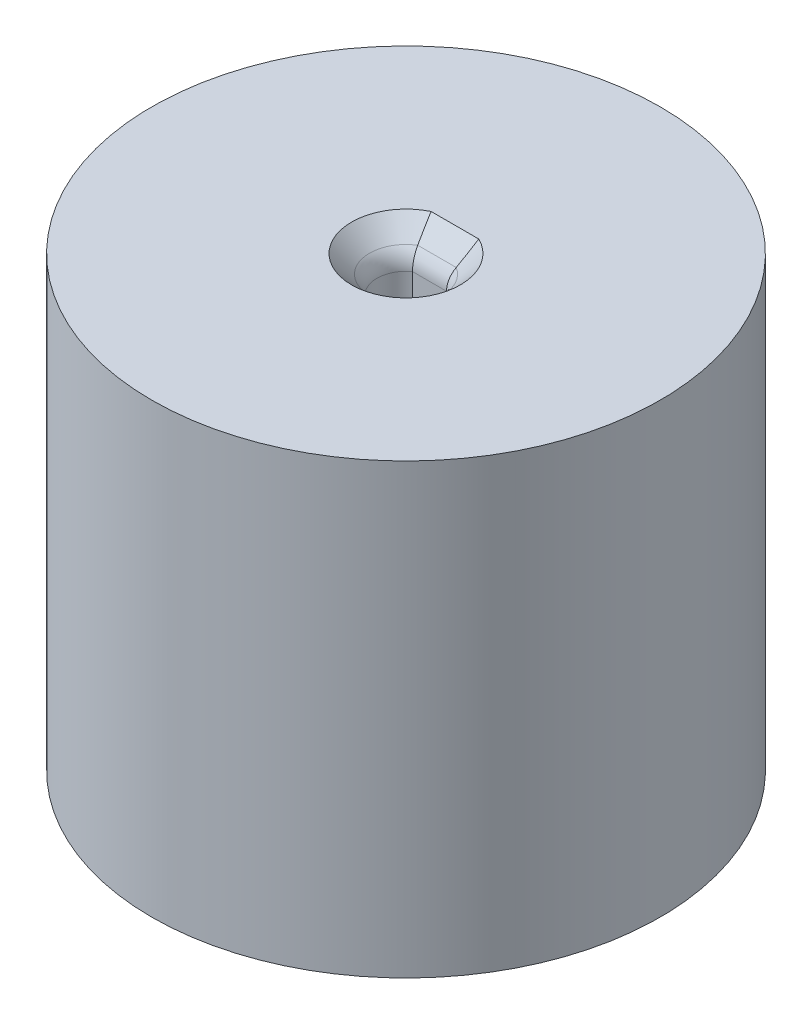
ISO-10303-21;
HEADER;
FILE_DESCRIPTION(('STEP AP214'),'2;1');
FILE_NAME('part.step','',(''),(''),'','','');
FILE_SCHEMA(('AUTOMOTIVE_DESIGN { 1 0 10303 214 1 1 1 1 }'));
ENDSEC;
DATA;
#1=APPLICATION_CONTEXT('core data for automotive mechanical design processes');
#2=APPLICATION_PROTOCOL_DEFINITION('international standard','automotive_design',2000,#1);
#3=PRODUCT_CONTEXT('',#1,'mechanical');
#4=PRODUCT('Part','Part','',(#3));
#5=PRODUCT_RELATED_PRODUCT_CATEGORY('part','',(#4));
#6=PRODUCT_DEFINITION_FORMATION('','',#4);
#7=PRODUCT_DEFINITION_CONTEXT('part definition',#1,'design');
#8=PRODUCT_DEFINITION('design','',#6,#7);
#9=PRODUCT_DEFINITION_SHAPE('','',#8);
#10=(LENGTH_UNIT() NAMED_UNIT(*) SI_UNIT(.MILLI.,.METRE.));
#11=(NAMED_UNIT(*) PLANE_ANGLE_UNIT() SI_UNIT($,.RADIAN.));
#12=(NAMED_UNIT(*) SI_UNIT($,.STERADIAN.) SOLID_ANGLE_UNIT());
#13=UNCERTAINTY_MEASURE_WITH_UNIT(LENGTH_MEASURE(1.E-05),#10,'distance_accuracy_value','');
#14=(GEOMETRIC_REPRESENTATION_CONTEXT(3) GLOBAL_UNCERTAINTY_ASSIGNED_CONTEXT((#13)) GLOBAL_UNIT_ASSIGNED_CONTEXT((#10,
#11,#12)) REPRESENTATION_CONTEXT('',''));
#15=CARTESIAN_POINT('',(0.,0.,0.));
#16=DIRECTION('',(0.,0.,1.));
#17=DIRECTION('',(1.,0.,0.));
#18=AXIS2_PLACEMENT_3D('',#15,#16,#17);
#19=CARTESIAN_POINT('',(0.,22.87,0.));
#20=DIRECTION('',(0.,-1.,0.));
#21=DIRECTION('',(0.,0.,-1.));
#22=AXIS2_PLACEMENT_3D('',#19,#20,#21);
#23=CONICAL_SURFACE('',#22,18.250000092,0.0327823058524812);
#24=CARTESIAN_POINT('',(0.,2.45674785656746,0.));
#25=DIRECTION('',(0.,1.,0.));
#26=DIRECTION('',(0.,0.,1.));
#27=AXIS2_PLACEMENT_3D('',#24,#25,#26);
#28=CIRCLE('',#27,18.9194333931584);
#29=CARTESIAN_POINT('',(0.,2.45674785656746,18.9194333931584));
#30=VERTEX_POINT('',#29);
#31=EDGE_CURVE('E45',#30,#30,#28,.F.);
#32=ORIENTED_EDGE('',*,*,#31,.T.);
#33=EDGE_LOOP('',(#32));
#34=FACE_BOUND('',#33,.T.);
#35=CARTESIAN_POINT('',(0.,22.87,0.));
#36=DIRECTION('',(0.,-1.,0.));
#37=DIRECTION('',(0.,0.,-1.));
#38=AXIS2_PLACEMENT_3D('',#35,#36,#37);
#39=CIRCLE('',#38,18.250000092);
#40=CARTESIAN_POINT('',(0.,22.87,-18.250000092));
#41=VERTEX_POINT('',#40);
#42=EDGE_CURVE('E98',#41,#41,#39,.T.);
#43=ORIENTED_EDGE('',*,*,#42,.F.);
#44=EDGE_LOOP('',(#43));
#45=FACE_BOUND('',#44,.T.);
#46=ADVANCED_FACE('F37',(#34,#45),#23,.F.);
#47=CARTESIAN_POINT('',(0.,22.87,0.));
#48=DIRECTION('',(0.,-1.,0.));
#49=DIRECTION('',(0.,0.,-1.));
#50=AXIS2_PLACEMENT_3D('',#47,#48,#49);
#51=PLANE('',#50);
#52=CARTESIAN_POINT('',(0.,22.87,0.));
#53=DIRECTION('',(0.,-1.,0.));
#54=DIRECTION('',(0.,0.,-1.));
#55=AXIS2_PLACEMENT_3D('',#52,#53,#54);
#56=CIRCLE('',#55,2.900000034);
#57=CARTESIAN_POINT('',(1.69926449418564,22.87,-2.35000008));
#58=VERTEX_POINT('',#57);
#59=CARTESIAN_POINT('',(-1.69926449418564,22.87,-2.35000008));
#60=VERTEX_POINT('',#59);
#61=EDGE_CURVE('E86',#58,#60,#56,.T.);
#62=ORIENTED_EDGE('',*,*,#61,.F.);
#63=DIRECTION('',(1.,0.,0.));
#64=VECTOR('',#63,1.);
#65=CARTESIAN_POINT('',(0.,22.87,-2.35000008));
#66=LINE('',#65,#64);
#67=EDGE_CURVE('E95',#60,#58,#66,.T.);
#68=ORIENTED_EDGE('',*,*,#67,.F.);
#69=EDGE_LOOP('',(#62,#68));
#70=FACE_BOUND('',#69,.T.);
#71=ORIENTED_EDGE('',*,*,#42,.T.);
#72=EDGE_LOOP('',(#71));
#73=FACE_BOUND('',#72,.T.);
#74=ADVANCED_FACE('F100',(#70,#73),#51,.T.);
#75=CARTESIAN_POINT('',(0.,31.75,0.));
#76=DIRECTION('',(0.,-1.,0.));
#77=DIRECTION('',(0.,0.,-1.));
#78=AXIS2_PLACEMENT_3D('',#75,#76,#77);
#79=CYLINDRICAL_SURFACE('',#78,25.4);
#80=CARTESIAN_POINT('',(0.,0.,0.));
#81=DIRECTION('',(0.,-1.,0.));
#82=DIRECTION('',(0.,0.,-1.));
#83=AXIS2_PLACEMENT_3D('',#80,#81,#82);
#84=CIRCLE('',#83,25.4);
#85=CARTESIAN_POINT('',(0.,0.,-25.4));
#86=VERTEX_POINT('',#85);
#87=EDGE_CURVE('E155',#86,#86,#84,.T.);
#88=ORIENTED_EDGE('',*,*,#87,.F.);
#89=EDGE_LOOP('',(#88));
#90=FACE_BOUND('',#89,.T.);
#91=CARTESIAN_POINT('',(0.,44.75,0.));
#92=DIRECTION('',(0.,1.,0.));
#93=DIRECTION('',(0.,0.,1.));
#94=AXIS2_PLACEMENT_3D('',#91,#92,#93);
#95=CIRCLE('',#94,25.4);
#96=CARTESIAN_POINT('',(0.,44.75,25.4));
#97=VERTEX_POINT('',#96);
#98=EDGE_CURVE('E93',#97,#97,#95,.T.);
#99=ORIENTED_EDGE('',*,*,#98,.F.);
#100=EDGE_LOOP('',(#99));
#101=FACE_BOUND('',#100,.T.);
#102=ADVANCED_FACE('F168',(#90,#101),#79,.T.);
#103=CARTESIAN_POINT('',(0.,0.,0.));
#104=DIRECTION('',(0.,-1.,0.));
#105=DIRECTION('',(0.,0.,-1.));
#106=AXIS2_PLACEMENT_3D('',#103,#104,#105);
#107=PLANE('',#106);
#108=CARTESIAN_POINT('',(0.,0.,0.));
#109=DIRECTION('',(0.,-1.,0.));
#110=DIRECTION('',(0.,0.,-1.));
#111=AXIS2_PLACEMENT_3D('',#108,#109,#110);
#112=CIRCLE('',#111,21.458068672322);
#113=CARTESIAN_POINT('',(0.,0.,-21.458068672322));
#114=VERTEX_POINT('',#113);
#115=EDGE_CURVE('E11',#114,#114,#112,.F.);
#116=ORIENTED_EDGE('',*,*,#115,.T.);
#117=EDGE_LOOP('',(#116));
#118=FACE_BOUND('',#117,.T.);
#119=ORIENTED_EDGE('',*,*,#87,.T.);
#120=EDGE_LOOP('',(#119));
#121=FACE_BOUND('',#120,.T.);
#122=ADVANCED_FACE('F169',(#118,#121),#107,.T.);
#123=CARTESIAN_POINT('',(0.,44.75,0.));
#124=DIRECTION('',(0.,-1.,0.));
#125=DIRECTION('',(0.,0.,-1.));
#126=AXIS2_PLACEMENT_3D('',#123,#124,#125);
#127=CYLINDRICAL_SURFACE('',#126,2.900000034);
#128=DIRECTION('',(0.,-1.,0.));
#129=VECTOR('',#128,1.);
#130=CARTESIAN_POINT('',(-1.69926449418564,44.75,-2.35000008));
#131=LINE('',#130,#129);
#132=CARTESIAN_POINT('',(-1.69926449418564,41.1578975515723,-2.35000008));
#133=VERTEX_POINT('',#132);
#134=EDGE_CURVE('E92',#133,#60,#131,.T.);
#135=ORIENTED_EDGE('',*,*,#134,.F.);
#136=CARTESIAN_POINT('',(0.,41.1578975515723,0.));
#137=DIRECTION('',(0.,-1.,0.));
#138=DIRECTION('',(0.,0.,-1.));
#139=AXIS2_PLACEMENT_3D('',#136,#137,#138);
#140=CIRCLE('',#139,2.900000034);
#141=CARTESIAN_POINT('',(1.69926449418564,41.1578975515723,-2.35000008));
#142=VERTEX_POINT('',#141);
#143=EDGE_CURVE('E89',#133,#142,#140,.F.);
#144=ORIENTED_EDGE('',*,*,#143,.T.);
#145=DIRECTION('',(0.,-1.,0.));
#146=VECTOR('',#145,1.);
#147=CARTESIAN_POINT('',(1.69926449418564,44.75,-2.35000008));
#148=LINE('',#147,#146);
#149=EDGE_CURVE('E81',#142,#58,#148,.T.);
#150=ORIENTED_EDGE('',*,*,#149,.T.);
#151=ORIENTED_EDGE('',*,*,#61,.T.);
#152=EDGE_LOOP('',(#135,#144,#150,#151));
#153=FACE_BOUND('',#152,.T.);
#154=ADVANCED_FACE('F84',(#153),#127,.F.);
#155=CARTESIAN_POINT('',(0.,44.75,-2.35000008));
#156=DIRECTION('',(0.,0.,1.));
#157=DIRECTION('',(1.,0.,0.));
#158=AXIS2_PLACEMENT_3D('',#155,#156,#157);
#159=PLANE('',#158);
#160=ORIENTED_EDGE('',*,*,#149,.F.);
#161=DIRECTION('',(1.,0.,0.));
#162=VECTOR('',#161,1.);
#163=CARTESIAN_POINT('',(0.,41.1578975515723,-2.35000008));
#164=LINE('',#163,#162);
#165=EDGE_CURVE('E110',#142,#133,#164,.F.);
#166=ORIENTED_EDGE('',*,*,#165,.T.);
#167=ORIENTED_EDGE('',*,*,#134,.T.);
#168=ORIENTED_EDGE('',*,*,#67,.T.);
#169=EDGE_LOOP('',(#160,#166,#167,#168));
#170=FACE_BOUND('',#169,.T.);
#171=ADVANCED_FACE('F96',(#170),#159,.T.);
#172=CARTESIAN_POINT('',(0.,44.75,0.));
#173=DIRECTION('',(0.,1.,0.));
#174=DIRECTION('',(0.,0.,1.));
#175=AXIS2_PLACEMENT_3D('',#172,#173,#174);
#176=PLANE('',#175);
#177=CARTESIAN_POINT('',(0.,44.75,0.));
#178=DIRECTION('',(0.,1.,0.));
#179=DIRECTION('',(0.,0.,1.));
#180=AXIS2_PLACEMENT_3D('',#177,#178,#179);
#181=CIRCLE('',#180,5.44000003400005);
#182=CARTESIAN_POINT('',(2.38358964327369,44.75,-4.89000007999989));
#183=VERTEX_POINT('',#182);
#184=CARTESIAN_POINT('',(-2.38358964327369,44.75,-4.89000007999989));
#185=VERTEX_POINT('',#184);
#186=EDGE_CURVE('E102',#183,#185,#181,.F.);
#187=ORIENTED_EDGE('',*,*,#186,.T.);
#188=DIRECTION('',(1.,0.,0.));
#189=VECTOR('',#188,1.);
#190=CARTESIAN_POINT('',(0.,44.75,-4.89000008000005));
#191=LINE('',#190,#189);
#192=EDGE_CURVE('E104',#185,#183,#191,.T.);
#193=ORIENTED_EDGE('',*,*,#192,.T.);
#194=EDGE_LOOP('',(#187,#193));
#195=FACE_BOUND('',#194,.T.);
#196=ORIENTED_EDGE('',*,*,#98,.T.);
#197=EDGE_LOOP('',(#196));
#198=FACE_BOUND('',#197,.T.);
#199=ADVANCED_FACE('F130',(#195,#198),#176,.T.);
#200=CARTESIAN_POINT('',(0.,42.21,0.));
#201=DIRECTION('',(0.,1.,0.));
#202=DIRECTION('',(0.,0.,1.));
#203=AXIS2_PLACEMENT_3D('',#200,#201,#202);
#204=CONICAL_SURFACE('',#203,2.900000034,0.78539816339745);
#205=CARTESIAN_POINT('',(2.38358964327377,44.75,-4.89000008000005));
#206=CARTESIAN_POINT('',(2.3344678731231,44.5373073124627,-4.67730739246279));
#207=CARTESIAN_POINT('',(2.28395008501503,44.3247695647966,-4.46476964479663));
#208=CARTESIAN_POINT('',(2.17933399602129,43.9001878120358,-4.04018789203583));
#209=CARTESIAN_POINT('',(2.12523654003249,43.688143702574,-3.82814378257407));
#210=CARTESIAN_POINT('',(2.01264061896365,43.2645965543966,-3.40459663439663));
#211=CARTESIAN_POINT('',(1.95414139974828,43.0530936148448,-3.19309369484481));
#212=CARTESIAN_POINT('',(1.86212655240117,42.7364329325888,-2.87643301258881));
#213=CARTESIAN_POINT('',(1.83073994594335,42.6309658153944,-2.77096589539441));
#214=CARTESIAN_POINT('',(1.76630672786688,42.4202821825694,-2.56028226256945));
#215=CARTESIAN_POINT('',(1.73326006253756,42.3150656751628,-2.4550657551628));
#216=CARTESIAN_POINT('',(1.69926449418577,42.21,-2.35000007999999));
#217=B_SPLINE_CURVE_WITH_KNOTS('',3,(#205,#206,#207,#208,#209,#210,#211,#212,#213,#214,#215,
#216),.UNSPECIFIED.,.F.,.F.,(4,2,2,2,2,4),(0.,0.914341543994176,1.8284680435642,2.7427515146986,
3.20000205154783,3.65726739212557),.UNSPECIFIED.);
#218=CARTESIAN_POINT('',(1.92505672802686,42.9539487757861,-3.09394885578617));
#219=VERTEX_POINT('',#218);
#220=EDGE_CURVE('E118',#219,#183,#217,.F.);
#221=ORIENTED_EDGE('',*,*,#220,.F.);
#222=CARTESIAN_POINT('',(0.,42.9539487757861,0.));
#223=DIRECTION('',(0.,-1.,0.));
#224=DIRECTION('',(0.,0.,-1.));
#225=AXIS2_PLACEMENT_3D('',#222,#223,#224);
#226=CIRCLE('',#225,3.64394880978618);
#227=CARTESIAN_POINT('',(-1.92505672802686,42.9539487757861,-3.09394885578617));
#228=VERTEX_POINT('',#227);
#229=EDGE_CURVE('E52',#219,#228,#226,.T.);
#230=ORIENTED_EDGE('',*,*,#229,.T.);
#231=CARTESIAN_POINT('',(-1.69926449418564,42.21,-2.35000008));
#232=CARTESIAN_POINT('',(-1.73326006253752,42.3150656751628,-2.45506575516281));
#233=CARTESIAN_POINT('',(-1.76630672786686,42.4202821825694,-2.56028226256945));
#234=CARTESIAN_POINT('',(-1.83073994594336,42.6309658153944,-2.77096589539441));
#235=CARTESIAN_POINT('',(-1.86212655240117,42.7364329325888,-2.87643301258881));
#236=CARTESIAN_POINT('',(-1.95414139974827,43.0530936148448,-3.19309369484481));
#237=CARTESIAN_POINT('',(-2.01264061896366,43.2645965543966,-3.40459663439662));
#238=CARTESIAN_POINT('',(-2.12523654003248,43.688143702574,-3.82814378257406));
#239=CARTESIAN_POINT('',(-2.17933399602127,43.9001878120358,-4.04018789203582));
#240=CARTESIAN_POINT('',(-2.28395008501505,44.3247695647966,-4.46476964479661));
#241=CARTESIAN_POINT('',(-2.33446787312317,44.5373073124627,-4.67730739246277));
#242=CARTESIAN_POINT('',(-2.38358964327398,44.75,-4.89000008000001));
#243=B_SPLINE_CURVE_WITH_KNOTS('',3,(#231,#232,#233,#234,#235,#236,#237,#238,#239,#240,#241,
#242),.UNSPECIFIED.,.F.,.F.,(4,2,2,2,2,4),(0.,0.457265340577748,0.914515877426984,
1.82879934856137,2.74292584813138,3.65726739212557),.UNSPECIFIED.);
#244=EDGE_CURVE('E111',#185,#228,#243,.F.);
#245=ORIENTED_EDGE('',*,*,#244,.F.);
#246=ORIENTED_EDGE('',*,*,#186,.F.);
#247=EDGE_LOOP('',(#221,#230,#245,#246));
#248=FACE_BOUND('',#247,.T.);
#249=ADVANCED_FACE('F126',(#248),#204,.F.);
#250=CARTESIAN_POINT('',(0.,42.21,-2.35000008));
#251=DIRECTION('',(0.,-0.707106781186549,-0.707106781186546));
#252=DIRECTION('',(-1.,0.,0.));
#253=AXIS2_PLACEMENT_3D('',#250,#251,#252);
#254=PLANE('',#253);
#255=ORIENTED_EDGE('',*,*,#244,.T.);
#256=DIRECTION('',(-1.,0.,0.));
#257=VECTOR('',#256,1.);
#258=CARTESIAN_POINT('',(0.,42.9539487757861,-3.09394885578617));
#259=LINE('',#258,#257);
#260=EDGE_CURVE('E151',#228,#219,#259,.F.);
#261=ORIENTED_EDGE('',*,*,#260,.T.);
#262=ORIENTED_EDGE('',*,*,#220,.T.);
#263=ORIENTED_EDGE('',*,*,#192,.F.);
#264=EDGE_LOOP('',(#255,#261,#262,#263));
#265=FACE_BOUND('',#264,.T.);
#266=ADVANCED_FACE('F123',(#265),#254,.F.);
#267=CARTESIAN_POINT('',(0.,41.1578975515723,0.));
#268=DIRECTION('',(0.,-1.,0.));
#269=DIRECTION('',(0.,0.,-1.));
#270=AXIS2_PLACEMENT_3D('',#267,#268,#269);
#271=TOROIDAL_SURFACE('',#270,5.440000034,2.54);
#272=CARTESIAN_POINT('',(-1.69926449418564,41.1578975515723,-2.35000008));
#273=CARTESIAN_POINT('',(-1.69925864093517,41.2270903732254,-2.34999133212024));
#274=CARTESIAN_POINT('',(-1.7001794949422,41.2962784188727,-2.35282724236649));
#275=CARTESIAN_POINT('',(-1.70383076528686,41.4341356865861,-2.36412135888005));
#276=CARTESIAN_POINT('',(-1.70656090139035,41.5028049873335,-2.37257869446264));
#277=CARTESIAN_POINT('',(-1.71378174516937,41.6390398069799,-2.39503262249768));
#278=CARTESIAN_POINT('',(-1.71826993101842,41.7066067631603,-2.40902128084022));
#279=CARTESIAN_POINT('',(-1.72892033495472,41.8402398663092,-2.442397730453));
#280=CARTESIAN_POINT('',(-1.73508252962066,41.9063060342614,-2.46178544618427));
#281=CARTESIAN_POINT('',(-1.75592845908103,42.1015581176706,-2.52780970692393));
#282=CARTESIAN_POINT('',(-1.77297830407038,42.227920521991,-2.58232786741844));
#283=CARTESIAN_POINT('',(-1.81230708539306,42.4694483473634,-2.71052326508342));
#284=CARTESIAN_POINT('',(-1.83458131782317,42.5846237097901,-2.78418327383198));
#285=CARTESIAN_POINT('',(-1.86922643334837,42.7390156728625,-2.90127218271167));
#286=CARTESIAN_POINT('',(-1.87995977784114,42.7839452444758,-2.93784267091026));
#287=CARTESIAN_POINT('',(-1.90205436423014,42.8710328354321,-3.01380835702889));
#288=CARTESIAN_POINT('',(-1.91341439384671,42.9131958827164,-3.05319814229579));
#289=CARTESIAN_POINT('',(-1.92505672802686,42.9539487757861,-3.09394885578617));
#290=B_SPLINE_CURVE_WITH_KNOTS('',3,(#272,#273,#274,#275,#276,#277,#278,#279,#280,#281,#282,
#283,#284,#285,#286,#287,#288,#289),.UNSPECIFIED.,.F.,.F.,(4,2,2,2,2,2,2,2,4),(0.,
0.207506081610273,0.414980030750497,0.622157453314802,0.829331977376137,1.24331142277741,
1.6569195530306,1.8335598443215,2.00986966541943),.UNSPECIFIED.);
#291=EDGE_CURVE('E139',#228,#133,#290,.F.);
#292=ORIENTED_EDGE('',*,*,#291,.F.);
#293=ORIENTED_EDGE('',*,*,#229,.F.);
#294=CARTESIAN_POINT('',(1.92505672802933,42.9539487757861,-3.09394885578617));
#295=CARTESIAN_POINT('',(1.91096467919708,42.904627484172,-3.04461975754736));
#296=CARTESIAN_POINT('',(1.89728047430037,42.8532066599236,-2.99727074459858));
#297=CARTESIAN_POINT('',(1.87088414754713,42.7464824270702,-2.90685012157607));
#298=CARTESIAN_POINT('',(1.85817222156471,42.6911782404095,-2.86377937287691));
#299=CARTESIAN_POINT('',(1.83385475526022,42.5768928020551,-2.78215900705112));
#300=CARTESIAN_POINT('',(1.82225182212146,42.5179033996287,-2.74361999712816));
#301=CARTESIAN_POINT('',(1.80035061629896,42.3967691819817,-2.67149346895733));
#302=CARTESIAN_POINT('',(1.79005220800414,42.3346246956884,-2.63790543597413));
#303=CARTESIAN_POINT('',(1.76131706156719,42.1438124505429,-2.54488185904652));
#304=CARTESIAN_POINT('',(1.74506488255768,42.0108794693055,-2.49326804472142));
#305=CARTESIAN_POINT('',(1.71959804124082,41.7379478322679,-2.41304573288631));
#306=CARTESIAN_POINT('',(1.71036424198167,41.5979695076961,-2.38437466622879));
#307=CARTESIAN_POINT('',(1.70306501703756,41.4070451833884,-2.36175345670828));
#308=CARTESIAN_POINT('',(1.70164087837586,41.3573074100244,-2.35734655874404));
#309=CARTESIAN_POINT('',(1.69974123929649,41.257686125784,-2.35147224863073));
#310=CARTESIAN_POINT('',(1.69926487322327,41.2078027896099,-2.35000215412411));
#311=CARTESIAN_POINT('',(1.69926449418565,41.1578975515723,-2.35000008));
#312=B_SPLINE_CURVE_WITH_KNOTS('',3,(#294,#295,#296,#297,#298,#299,#300,#301,#302,#303,#304,
#305,#306,#307,#308,#309,#310,#311),.UNSPECIFIED.,.F.,.F.,(4,2,2,2,2,2,2,2,4),(0.,
0.213439200244894,0.426921287046424,0.640893512122153,0.854843475558368,1.28316312931035,
1.71031065608373,1.86009570690446,2.00974388745141),.UNSPECIFIED.);
#313=EDGE_CURVE('E60',#142,#219,#312,.F.);
#314=ORIENTED_EDGE('',*,*,#313,.F.);
#315=ORIENTED_EDGE('',*,*,#143,.F.);
#316=EDGE_LOOP('',(#292,#293,#314,#315));
#317=FACE_BOUND('',#316,.T.);
#318=ADVANCED_FACE('F135',(#317),#271,.T.);
#319=CARTESIAN_POINT('',(0.,41.1578975515723,-4.89000008));
#320=DIRECTION('',(1.,0.,0.));
#321=DIRECTION('',(0.,0.,-1.));
#322=AXIS2_PLACEMENT_3D('',#319,#320,#321);
#323=CYLINDRICAL_SURFACE('',#322,2.54);
#324=ORIENTED_EDGE('',*,*,#313,.T.);
#325=ORIENTED_EDGE('',*,*,#260,.F.);
#326=ORIENTED_EDGE('',*,*,#291,.T.);
#327=ORIENTED_EDGE('',*,*,#165,.F.);
#328=EDGE_LOOP('',(#324,#325,#326,#327));
#329=FACE_BOUND('',#328,.T.);
#330=ADVANCED_FACE('F131',(#329),#323,.T.);
#331=CARTESIAN_POINT('',(0.,2.54,0.));
#332=DIRECTION('',(0.,-1.,0.));
#333=DIRECTION('',(0.,0.,-1.));
#334=AXIS2_PLACEMENT_3D('',#331,#332,#333);
#335=TOROIDAL_SURFACE('',#334,21.458068672322,2.54);
#336=ORIENTED_EDGE('',*,*,#115,.F.);
#337=EDGE_LOOP('',(#336));
#338=FACE_BOUND('',#337,.T.);
#339=ORIENTED_EDGE('',*,*,#31,.F.);
#340=EDGE_LOOP('',(#339));
#341=FACE_BOUND('',#340,.T.);
#342=ADVANCED_FACE('F39',(#338,#341),#335,.T.);
#343=CLOSED_SHELL('',(#46,#74,#102,#122,#154,#171,#199,#249,#266,#318,#330,#342));
#344=MANIFOLD_SOLID_BREP('B2',#343);
#345=ADVANCED_BREP_SHAPE_REPRESENTATION('',(#18,#344),#14);
#346=SHAPE_DEFINITION_REPRESENTATION(#9,#345);
ENDSEC;
END-ISO-10303-21;
